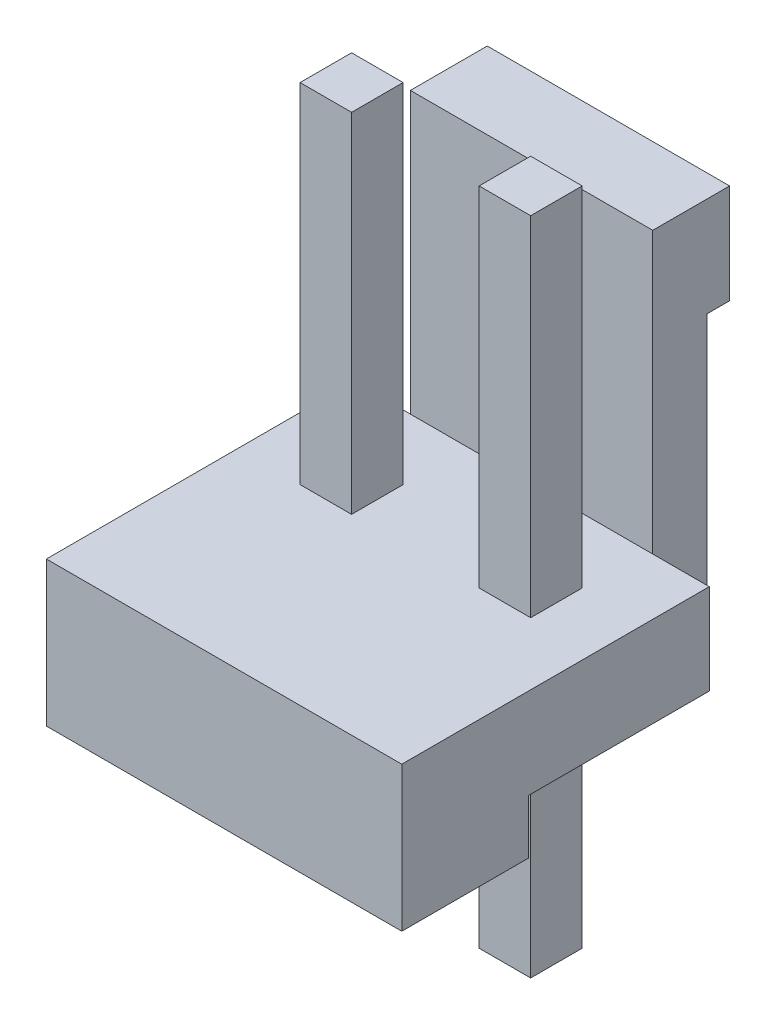
ISO-10303-21;
HEADER;
FILE_DESCRIPTION(('STEP AP214'),'2;1');
FILE_NAME('part.step','',(''),(''),'','','');
FILE_SCHEMA(('AUTOMOTIVE_DESIGN { 1 0 10303 214 1 1 1 1 }'));
ENDSEC;
DATA;
#1=APPLICATION_CONTEXT('core data for automotive mechanical design processes');
#2=APPLICATION_PROTOCOL_DEFINITION('international standard','automotive_design',2000,#1);
#3=PRODUCT_CONTEXT('',#1,'mechanical');
#4=PRODUCT('Part','Part','',(#3));
#5=PRODUCT_RELATED_PRODUCT_CATEGORY('part','',(#4));
#6=PRODUCT_DEFINITION_FORMATION('','',#4);
#7=PRODUCT_DEFINITION_CONTEXT('part definition',#1,'design');
#8=PRODUCT_DEFINITION('design','',#6,#7);
#9=PRODUCT_DEFINITION_SHAPE('','',#8);
#10=(LENGTH_UNIT() NAMED_UNIT(*) SI_UNIT(.MILLI.,.METRE.));
#11=(NAMED_UNIT(*) PLANE_ANGLE_UNIT() SI_UNIT($,.RADIAN.));
#12=(NAMED_UNIT(*) SI_UNIT($,.STERADIAN.) SOLID_ANGLE_UNIT());
#13=UNCERTAINTY_MEASURE_WITH_UNIT(LENGTH_MEASURE(1.E-05),#10,'distance_accuracy_value','');
#14=(GEOMETRIC_REPRESENTATION_CONTEXT(3) GLOBAL_UNCERTAINTY_ASSIGNED_CONTEXT((#13)) GLOBAL_UNIT_ASSIGNED_CONTEXT((#10,
#11,#12)) REPRESENTATION_CONTEXT('',''));
#15=CARTESIAN_POINT('',(0.,0.,0.));
#16=DIRECTION('',(0.,0.,1.));
#17=DIRECTION('',(1.,0.,0.));
#18=AXIS2_PLACEMENT_3D('',#15,#16,#17);
#19=CARTESIAN_POINT('',(1.41,10.9,-1.12));
#20=DIRECTION('',(1.,0.,0.));
#21=DIRECTION('',(0.,1.,0.));
#22=AXIS2_PLACEMENT_3D('',#19,#20,#21);
#23=PLANE('',#22);
#24=DIRECTION('',(0.,-1.,0.));
#25=VECTOR('',#24,1.);
#26=CARTESIAN_POINT('',(1.41,10.9,-1.12));
#27=LINE('',#26,#25);
#28=CARTESIAN_POINT('',(1.40999999999998,1.2,-1.11999999999999));
#29=VERTEX_POINT('',#28);
#30=CARTESIAN_POINT('',(1.40999999999999,-3.7,-1.11999999999997));
#31=VERTEX_POINT('',#30);
#32=EDGE_CURVE('E210',#29,#31,#27,.T.);
#33=ORIENTED_EDGE('',*,*,#32,.T.);
#34=DIRECTION('',(0.,0.,1.));
#35=VECTOR('',#34,1.);
#36=CARTESIAN_POINT('',(1.41,-3.7,0.02000000000004));
#37=LINE('',#36,#35);
#38=CARTESIAN_POINT('',(1.40999999999999,-3.7,0.0200000000000362));
#39=VERTEX_POINT('',#38);
#40=EDGE_CURVE('E286',#31,#39,#37,.T.);
#41=ORIENTED_EDGE('',*,*,#40,.T.);
#42=DIRECTION('',(0.,1.,0.));
#43=VECTOR('',#42,1.);
#44=CARTESIAN_POINT('',(1.41,10.9,0.01999999999999));
#45=LINE('',#44,#43);
#46=CARTESIAN_POINT('',(1.40999999999998,1.2,0.0200000000000216));
#47=VERTEX_POINT('',#46);
#48=EDGE_CURVE('E215',#39,#47,#45,.T.);
#49=ORIENTED_EDGE('',*,*,#48,.T.);
#50=DIRECTION('',(0.,0.,1.));
#51=VECTOR('',#50,1.);
#52=CARTESIAN_POINT('',(1.40999999999997,1.2,-1.12));
#53=LINE('',#52,#51);
#54=EDGE_CURVE('E20',#29,#47,#53,.T.);
#55=ORIENTED_EDGE('',*,*,#54,.F.);
#56=EDGE_LOOP('',(#33,#41,#49,#55));
#57=FACE_BOUND('',#56,.T.);
#58=ADVANCED_FACE('F17',(#57),#23,.F.);
#59=CARTESIAN_POINT('',(-2.55,10.9,-1.12));
#60=DIRECTION('',(1.,0.,0.));
#61=DIRECTION('',(0.,1.,0.));
#62=AXIS2_PLACEMENT_3D('',#59,#60,#61);
#63=PLANE('',#62);
#64=DIRECTION('',(0.,-1.,0.));
#65=VECTOR('',#64,1.);
#66=CARTESIAN_POINT('',(-2.55,10.9,-1.12));
#67=LINE('',#66,#65);
#68=CARTESIAN_POINT('',(-2.55000000000002,1.2,-1.11999999999999));
#69=VERTEX_POINT('',#68);
#70=CARTESIAN_POINT('',(-2.55000000000001,-3.7,-1.11999999999997));
#71=VERTEX_POINT('',#70);
#72=EDGE_CURVE('E274',#69,#71,#67,.T.);
#73=ORIENTED_EDGE('',*,*,#72,.T.);
#74=DIRECTION('',(0.,0.,1.));
#75=VECTOR('',#74,1.);
#76=CARTESIAN_POINT('',(-2.55,-3.7,0.02000000000004));
#77=LINE('',#76,#75);
#78=CARTESIAN_POINT('',(-2.55000000000001,-3.7,0.0200000000000362));
#79=VERTEX_POINT('',#78);
#80=EDGE_CURVE('E252',#71,#79,#77,.T.);
#81=ORIENTED_EDGE('',*,*,#80,.T.);
#82=DIRECTION('',(0.,1.,0.));
#83=VECTOR('',#82,1.);
#84=CARTESIAN_POINT('',(-2.55,10.9,0.01999999999999));
#85=LINE('',#84,#83);
#86=CARTESIAN_POINT('',(-2.55000000000002,1.2,0.0200000000000216));
#87=VERTEX_POINT('',#86);
#88=EDGE_CURVE('E249',#79,#87,#85,.T.);
#89=ORIENTED_EDGE('',*,*,#88,.T.);
#90=DIRECTION('',(0.,0.,1.));
#91=VECTOR('',#90,1.);
#92=CARTESIAN_POINT('',(-2.55000000000003,1.2,-1.12));
#93=LINE('',#92,#91);
#94=EDGE_CURVE('E218',#69,#87,#93,.T.);
#95=ORIENTED_EDGE('',*,*,#94,.F.);
#96=EDGE_LOOP('',(#73,#81,#89,#95));
#97=FACE_BOUND('',#96,.T.);
#98=ADVANCED_FACE('F250',(#97),#63,.F.);
#99=CARTESIAN_POINT('',(-3.93,7.2,-4.25));
#100=DIRECTION('',(0.,-1.,0.));
#101=DIRECTION('',(0.,0.,-1.));
#102=AXIS2_PLACEMENT_3D('',#99,#100,#101);
#103=PLANE('',#102);
#104=DIRECTION('',(0.,0.,-1.));
#105=VECTOR('',#104,1.);
#106=CARTESIAN_POINT('',(2.68,7.19999999999998,-4.25));
#107=LINE('',#106,#105);
#108=CARTESIAN_POINT('',(2.68,7.19999999999999,-4.25));
#109=VERTEX_POINT('',#108);
#110=CARTESIAN_POINT('',(2.68,7.19999999999999,-3.75000000000001));
#111=VERTEX_POINT('',#110);
#112=EDGE_CURVE('E231',#109,#111,#107,.F.);
#113=ORIENTED_EDGE('',*,*,#112,.T.);
#114=DIRECTION('',(1.,0.,0.));
#115=VECTOR('',#114,1.);
#116=CARTESIAN_POINT('',(-3.93,7.2,-3.75000000000002));
#117=LINE('',#116,#115);
#118=CARTESIAN_POINT('',(-2.68,7.2,-3.75000000000001));
#119=VERTEX_POINT('',#118);
#120=EDGE_CURVE('E264',#119,#111,#117,.T.);
#121=ORIENTED_EDGE('',*,*,#120,.F.);
#122=DIRECTION('',(0.,0.,-1.));
#123=VECTOR('',#122,1.);
#124=CARTESIAN_POINT('',(-2.68,7.2,-4.25));
#125=LINE('',#124,#123);
#126=CARTESIAN_POINT('',(-2.68,7.2,-4.25));
#127=VERTEX_POINT('',#126);
#128=EDGE_CURVE('E233',#119,#127,#125,.T.);
#129=ORIENTED_EDGE('',*,*,#128,.T.);
#130=DIRECTION('',(1.,0.,0.));
#131=VECTOR('',#130,1.);
#132=CARTESIAN_POINT('',(-3.93,7.2,-4.25));
#133=LINE('',#132,#131);
#134=EDGE_CURVE('E373',#109,#127,#133,.F.);
#135=ORIENTED_EDGE('',*,*,#134,.F.);
#136=EDGE_LOOP('',(#113,#121,#129,#135));
#137=FACE_BOUND('',#136,.T.);
#138=ADVANCED_FACE('F399',(#137),#103,.T.);
#139=CARTESIAN_POINT('',(1.41,10.9,-1.12));
#140=DIRECTION('',(0.,0.,1.));
#141=DIRECTION('',(0.,-1.,0.));
#142=AXIS2_PLACEMENT_3D('',#139,#140,#141);
#143=PLANE('',#142);
#144=DIRECTION('',(0.,-1.,0.));
#145=VECTOR('',#144,1.);
#146=CARTESIAN_POINT('',(2.55,10.9,-1.12));
#147=LINE('',#146,#145);
#148=CARTESIAN_POINT('',(2.54999999999999,1.2,-1.11999999999998));
#149=VERTEX_POINT('',#148);
#150=CARTESIAN_POINT('',(2.54999999999999,-3.7,-1.11999999999997));
#151=VERTEX_POINT('',#150);
#152=EDGE_CURVE('E301',#149,#151,#147,.T.);
#153=ORIENTED_EDGE('',*,*,#152,.T.);
#154=DIRECTION('',(1.,0.,0.));
#155=VECTOR('',#154,1.);
#156=CARTESIAN_POINT('',(1.41,-3.7,-1.12));
#157=LINE('',#156,#155);
#158=EDGE_CURVE('E226',#151,#31,#157,.F.);
#159=ORIENTED_EDGE('',*,*,#158,.T.);
#160=ORIENTED_EDGE('',*,*,#32,.F.);
#161=DIRECTION('',(1.,0.,0.));
#162=VECTOR('',#161,1.);
#163=CARTESIAN_POINT('',(1.41,1.2,-1.11999999999996));
#164=LINE('',#163,#162);
#165=EDGE_CURVE('E220',#149,#29,#164,.F.);
#166=ORIENTED_EDGE('',*,*,#165,.F.);
#167=EDGE_LOOP('',(#153,#159,#160,#166));
#168=FACE_BOUND('',#167,.T.);
#169=ADVANCED_FACE('F228',(#168),#143,.F.);
#170=CARTESIAN_POINT('',(1.41,-3.7,0.02000000000004));
#171=DIRECTION('',(0.,1.,0.));
#172=DIRECTION('',(0.,0.,1.));
#173=AXIS2_PLACEMENT_3D('',#170,#171,#172);
#174=PLANE('',#173);
#175=ORIENTED_EDGE('',*,*,#158,.F.);
#176=DIRECTION('',(0.,0.,1.));
#177=VECTOR('',#176,1.);
#178=CARTESIAN_POINT('',(2.54999999999995,-3.7,-1.12));
#179=LINE('',#178,#177);
#180=CARTESIAN_POINT('',(2.54999999999999,-3.7,0.0200000000000412));
#181=VERTEX_POINT('',#180);
#182=EDGE_CURVE('E291',#151,#181,#179,.T.);
#183=ORIENTED_EDGE('',*,*,#182,.T.);
#184=DIRECTION('',(1.,0.,0.));
#185=VECTOR('',#184,1.);
#186=CARTESIAN_POINT('',(1.41,-3.7,0.0200000000000447));
#187=LINE('',#186,#185);
#188=EDGE_CURVE('E283',#181,#39,#187,.F.);
#189=ORIENTED_EDGE('',*,*,#188,.T.);
#190=ORIENTED_EDGE('',*,*,#40,.F.);
#191=EDGE_LOOP('',(#175,#183,#189,#190));
#192=FACE_BOUND('',#191,.T.);
#193=ADVANCED_FACE('F289',(#192),#174,.F.);
#194=CARTESIAN_POINT('',(1.41,10.9,0.01999999999999));
#195=DIRECTION('',(0.,0.,-1.));
#196=DIRECTION('',(0.,1.,0.));
#197=AXIS2_PLACEMENT_3D('',#194,#195,#196);
#198=PLANE('',#197);
#199=ORIENTED_EDGE('',*,*,#48,.F.);
#200=ORIENTED_EDGE('',*,*,#188,.F.);
#201=DIRECTION('',(0.,-1.,0.));
#202=VECTOR('',#201,1.);
#203=CARTESIAN_POINT('',(2.55,10.9,0.02000000000004));
#204=LINE('',#203,#202);
#205=CARTESIAN_POINT('',(2.54999999999999,1.2,0.0200000000000282));
#206=VERTEX_POINT('',#205);
#207=EDGE_CURVE('E296',#181,#206,#204,.F.);
#208=ORIENTED_EDGE('',*,*,#207,.T.);
#209=DIRECTION('',(1.,0.,0.));
#210=VECTOR('',#209,1.);
#211=CARTESIAN_POINT('',(1.41,1.2,0.0200000000000263));
#212=LINE('',#211,#210);
#213=EDGE_CURVE('E280',#47,#206,#212,.T.);
#214=ORIENTED_EDGE('',*,*,#213,.F.);
#215=EDGE_LOOP('',(#199,#200,#208,#214));
#216=FACE_BOUND('',#215,.T.);
#217=ADVANCED_FACE('F295',(#216),#198,.F.);
#218=CARTESIAN_POINT('',(-3.93,0.,-3.75));
#219=DIRECTION('',(0.,-1.,0.));
#220=DIRECTION('',(1.,0.,0.));
#221=AXIS2_PLACEMENT_3D('',#218,#219,#220);
#222=PLANE('',#221);
#223=DIRECTION('',(0.,0.,1.));
#224=VECTOR('',#223,1.);
#225=CARTESIAN_POINT('',(2.68,0.,-3.75));
#226=LINE('',#225,#224);
#227=CARTESIAN_POINT('',(2.67999999999999,0.,-3.75));
#228=VERTEX_POINT('',#227);
#229=CARTESIAN_POINT('',(2.67999999999999,0.,-2.55));
#230=VERTEX_POINT('',#229);
#231=EDGE_CURVE('E276',#228,#230,#226,.T.);
#232=ORIENTED_EDGE('',*,*,#231,.T.);
#233=DIRECTION('',(1.,0.,0.));
#234=VECTOR('',#233,1.);
#235=CARTESIAN_POINT('',(-3.93,0.,-2.55));
#236=LINE('',#235,#234);
#237=CARTESIAN_POINT('',(-2.68000000000001,0.,-2.55));
#238=VERTEX_POINT('',#237);
#239=EDGE_CURVE('E298',#238,#230,#236,.T.);
#240=ORIENTED_EDGE('',*,*,#239,.F.);
#241=DIRECTION('',(0.,0.,1.));
#242=VECTOR('',#241,1.);
#243=CARTESIAN_POINT('',(-2.68,0.,-3.75));
#244=LINE('',#243,#242);
#245=CARTESIAN_POINT('',(-2.68000000000001,0.,-3.75));
#246=VERTEX_POINT('',#245);
#247=EDGE_CURVE('E278',#238,#246,#244,.F.);
#248=ORIENTED_EDGE('',*,*,#247,.T.);
#249=DIRECTION('',(1.,0.,0.));
#250=VECTOR('',#249,1.);
#251=CARTESIAN_POINT('',(-3.93,0.,-3.75));
#252=LINE('',#251,#250);
#253=EDGE_CURVE('E376',#228,#246,#252,.F.);
#254=ORIENTED_EDGE('',*,*,#253,.F.);
#255=EDGE_LOOP('',(#232,#240,#248,#254));
#256=FACE_BOUND('',#255,.T.);
#257=ADVANCED_FACE('F393',(#256),#222,.T.);
#258=CARTESIAN_POINT('',(-2.55,10.9,-1.12));
#259=DIRECTION('',(0.,0.,1.));
#260=DIRECTION('',(0.,-1.,0.));
#261=AXIS2_PLACEMENT_3D('',#258,#259,#260);
#262=PLANE('',#261);
#263=DIRECTION('',(0.,-1.,0.));
#264=VECTOR('',#263,1.);
#265=CARTESIAN_POINT('',(-1.41,10.9,-1.12));
#266=LINE('',#265,#264);
#267=CARTESIAN_POINT('',(-1.41000000000001,1.2,-1.11999999999998));
#268=VERTEX_POINT('',#267);
#269=CARTESIAN_POINT('',(-1.41000000000001,-3.7,-1.11999999999997));
#270=VERTEX_POINT('',#269);
#271=EDGE_CURVE('E367',#268,#270,#266,.T.);
#272=ORIENTED_EDGE('',*,*,#271,.T.);
#273=DIRECTION('',(1.,0.,0.));
#274=VECTOR('',#273,1.);
#275=CARTESIAN_POINT('',(-2.55,-3.7,-1.12));
#276=LINE('',#275,#274);
#277=EDGE_CURVE('E270',#270,#71,#276,.F.);
#278=ORIENTED_EDGE('',*,*,#277,.T.);
#279=ORIENTED_EDGE('',*,*,#72,.F.);
#280=DIRECTION('',(1.,0.,0.));
#281=VECTOR('',#280,1.);
#282=CARTESIAN_POINT('',(-2.55,1.2,-1.11999999999996));
#283=LINE('',#282,#281);
#284=EDGE_CURVE('E245',#268,#69,#283,.F.);
#285=ORIENTED_EDGE('',*,*,#284,.F.);
#286=EDGE_LOOP('',(#272,#278,#279,#285));
#287=FACE_BOUND('',#286,.T.);
#288=ADVANCED_FACE('F825',(#287),#262,.F.);
#289=CARTESIAN_POINT('',(-2.55,-3.7,0.02000000000004));
#290=DIRECTION('',(0.,1.,0.));
#291=DIRECTION('',(0.,0.,1.));
#292=AXIS2_PLACEMENT_3D('',#289,#290,#291);
#293=PLANE('',#292);
#294=ORIENTED_EDGE('',*,*,#277,.F.);
#295=DIRECTION('',(0.,0.,1.));
#296=VECTOR('',#295,1.);
#297=CARTESIAN_POINT('',(-1.41000000000005,-3.7,-1.12));
#298=LINE('',#297,#296);
#299=CARTESIAN_POINT('',(-1.41000000000001,-3.7,0.0200000000000412));
#300=VERTEX_POINT('',#299);
#301=EDGE_CURVE('E365',#270,#300,#298,.T.);
#302=ORIENTED_EDGE('',*,*,#301,.T.);
#303=DIRECTION('',(1.,0.,0.));
#304=VECTOR('',#303,1.);
#305=CARTESIAN_POINT('',(-2.55,-3.7,0.0200000000000447));
#306=LINE('',#305,#304);
#307=EDGE_CURVE('E256',#300,#79,#306,.F.);
#308=ORIENTED_EDGE('',*,*,#307,.T.);
#309=ORIENTED_EDGE('',*,*,#80,.F.);
#310=EDGE_LOOP('',(#294,#302,#308,#309));
#311=FACE_BOUND('',#310,.T.);
#312=ADVANCED_FACE('F816',(#311),#293,.F.);
#313=CARTESIAN_POINT('',(-2.55,10.9,0.01999999999999));
#314=DIRECTION('',(0.,0.,-1.));
#315=DIRECTION('',(0.,1.,0.));
#316=AXIS2_PLACEMENT_3D('',#313,#314,#315);
#317=PLANE('',#316);
#318=ORIENTED_EDGE('',*,*,#88,.F.);
#319=ORIENTED_EDGE('',*,*,#307,.F.);
#320=DIRECTION('',(0.,-1.,0.));
#321=VECTOR('',#320,1.);
#322=CARTESIAN_POINT('',(-1.41,10.9,0.02000000000004));
#323=LINE('',#322,#321);
#324=CARTESIAN_POINT('',(-1.41000000000001,1.2,0.0200000000000282));
#325=VERTEX_POINT('',#324);
#326=EDGE_CURVE('E260',#300,#325,#323,.F.);
#327=ORIENTED_EDGE('',*,*,#326,.T.);
#328=DIRECTION('',(1.,0.,0.));
#329=VECTOR('',#328,1.);
#330=CARTESIAN_POINT('',(-2.55,1.2,0.0200000000000263));
#331=LINE('',#330,#329);
#332=EDGE_CURVE('E243',#87,#325,#331,.T.);
#333=ORIENTED_EDGE('',*,*,#332,.F.);
#334=EDGE_LOOP('',(#318,#319,#327,#333));
#335=FACE_BOUND('',#334,.T.);
#336=ADVANCED_FACE('F258',(#335),#317,.F.);
#337=CARTESIAN_POINT('',(1.41,10.9,-1.12));
#338=DIRECTION('',(1.,0.,0.));
#339=DIRECTION('',(0.,1.,0.));
#340=AXIS2_PLACEMENT_3D('',#337,#338,#339);
#341=PLANE('',#340);
#342=DIRECTION('',(0.,1.,0.));
#343=VECTOR('',#342,1.);
#344=CARTESIAN_POINT('',(1.41,10.9,0.01999999999999));
#345=LINE('',#344,#343);
#346=CARTESIAN_POINT('',(1.40999999999999,3.2,0.0200000000000023));
#347=VERTEX_POINT('',#346);
#348=CARTESIAN_POINT('',(1.41,10.9,0.01999999999999));
#349=VERTEX_POINT('',#348);
#350=EDGE_CURVE('E356',#347,#349,#345,.T.);
#351=ORIENTED_EDGE('',*,*,#350,.T.);
#352=DIRECTION('',(0.,0.,1.));
#353=VECTOR('',#352,1.);
#354=CARTESIAN_POINT('',(1.41,10.9,0.01999999999999));
#355=LINE('',#354,#353);
#356=CARTESIAN_POINT('',(1.41,10.9,-1.12));
#357=VERTEX_POINT('',#356);
#358=EDGE_CURVE('E350',#357,#349,#355,.T.);
#359=ORIENTED_EDGE('',*,*,#358,.F.);
#360=DIRECTION('',(0.,-1.,0.));
#361=VECTOR('',#360,1.);
#362=CARTESIAN_POINT('',(1.41,10.9,-1.12));
#363=LINE('',#362,#361);
#364=CARTESIAN_POINT('',(1.40999999999999,3.2,-1.11999999999999));
#365=VERTEX_POINT('',#364);
#366=EDGE_CURVE('E341',#357,#365,#363,.T.);
#367=ORIENTED_EDGE('',*,*,#366,.T.);
#368=DIRECTION('',(0.,0.,1.));
#369=VECTOR('',#368,1.);
#370=CARTESIAN_POINT('',(1.40999999999997,3.2,-1.12));
#371=LINE('',#370,#369);
#372=EDGE_CURVE('E262',#347,#365,#371,.F.);
#373=ORIENTED_EDGE('',*,*,#372,.F.);
#374=EDGE_LOOP('',(#351,#359,#367,#373));
#375=FACE_BOUND('',#374,.T.);
#376=ADVANCED_FACE('F800',(#375),#341,.F.);
#377=CARTESIAN_POINT('',(-3.93,0.,-3.75));
#378=DIRECTION('',(0.,0.,-1.));
#379=DIRECTION('',(0.,1.,0.));
#380=AXIS2_PLACEMENT_3D('',#377,#378,#379);
#381=PLANE('',#380);
#382=DIRECTION('',(0.,-1.,0.));
#383=VECTOR('',#382,1.);
#384=CARTESIAN_POINT('',(2.68,9.4,-3.75));
#385=LINE('',#384,#383);
#386=EDGE_CURVE('E326',#111,#228,#385,.T.);
#387=ORIENTED_EDGE('',*,*,#386,.T.);
#388=ORIENTED_EDGE('',*,*,#253,.T.);
#389=DIRECTION('',(0.,1.,0.));
#390=VECTOR('',#389,1.);
#391=CARTESIAN_POINT('',(-2.68,9.4,-3.75));
#392=LINE('',#391,#390);
#393=EDGE_CURVE('E329',#246,#119,#392,.T.);
#394=ORIENTED_EDGE('',*,*,#393,.T.);
#395=ORIENTED_EDGE('',*,*,#120,.T.);
#396=EDGE_LOOP('',(#387,#388,#394,#395));
#397=FACE_BOUND('',#396,.T.);
#398=ADVANCED_FACE('F382',(#397),#381,.T.);
#399=CARTESIAN_POINT('',(-3.93,7.2,-4.25));
#400=DIRECTION('',(0.,0.,-1.));
#401=DIRECTION('',(0.,1.,0.));
#402=AXIS2_PLACEMENT_3D('',#399,#400,#401);
#403=PLANE('',#402);
#404=DIRECTION('',(0.,-1.,0.));
#405=VECTOR('',#404,1.);
#406=CARTESIAN_POINT('',(2.68,9.4,-4.25));
#407=LINE('',#406,#405);
#408=CARTESIAN_POINT('',(2.68,9.4,-4.25));
#409=VERTEX_POINT('',#408);
#410=EDGE_CURVE('E318',#409,#109,#407,.T.);
#411=ORIENTED_EDGE('',*,*,#410,.T.);
#412=ORIENTED_EDGE('',*,*,#134,.T.);
#413=DIRECTION('',(0.,1.,0.));
#414=VECTOR('',#413,1.);
#415=CARTESIAN_POINT('',(-2.68,9.4,-4.25));
#416=LINE('',#415,#414);
#417=CARTESIAN_POINT('',(-2.68,9.4,-4.25));
#418=VERTEX_POINT('',#417);
#419=EDGE_CURVE('E335',#127,#418,#416,.T.);
#420=ORIENTED_EDGE('',*,*,#419,.T.);
#421=DIRECTION('',(1.,0.,0.));
#422=VECTOR('',#421,1.);
#423=CARTESIAN_POINT('',(-3.93,9.4,-4.25));
#424=LINE('',#423,#422);
#425=EDGE_CURVE('E303',#409,#418,#424,.F.);
#426=ORIENTED_EDGE('',*,*,#425,.F.);
#427=EDGE_LOOP('',(#411,#412,#420,#426));
#428=FACE_BOUND('',#427,.T.);
#429=ADVANCED_FACE('F401',(#428),#403,.T.);
#430=CARTESIAN_POINT('',(2.55,10.9,-1.12));
#431=DIRECTION('',(-1.,0.,0.));
#432=DIRECTION('',(0.,-1.,0.));
#433=AXIS2_PLACEMENT_3D('',#430,#431,#432);
#434=PLANE('',#433);
#435=ORIENTED_EDGE('',*,*,#207,.F.);
#436=ORIENTED_EDGE('',*,*,#182,.F.);
#437=ORIENTED_EDGE('',*,*,#152,.F.);
#438=DIRECTION('',(0.,0.,1.));
#439=VECTOR('',#438,1.);
#440=CARTESIAN_POINT('',(2.55,1.19999999999998,-2.55));
#441=LINE('',#440,#439);
#442=EDGE_CURVE('E223',#206,#149,#441,.F.);
#443=ORIENTED_EDGE('',*,*,#442,.F.);
#444=EDGE_LOOP('',(#435,#436,#437,#443));
#445=FACE_BOUND('',#444,.T.);
#446=ADVANCED_FACE('F300',(#445),#434,.F.);
#447=CARTESIAN_POINT('',(-3.93,0.,-2.55));
#448=DIRECTION('',(0.,0.,1.));
#449=DIRECTION('',(0.,-1.,0.));
#450=AXIS2_PLACEMENT_3D('',#447,#448,#449);
#451=PLANE('',#450);
#452=DIRECTION('',(0.,-1.,0.));
#453=VECTOR('',#452,1.);
#454=CARTESIAN_POINT('',(2.68,9.4,-2.55));
#455=LINE('',#454,#453);
#456=CARTESIAN_POINT('',(2.67999999999999,1.2,-2.55));
#457=VERTEX_POINT('',#456);
#458=EDGE_CURVE('E324',#230,#457,#455,.F.);
#459=ORIENTED_EDGE('',*,*,#458,.T.);
#460=DIRECTION('',(1.,0.,0.));
#461=VECTOR('',#460,1.);
#462=CARTESIAN_POINT('',(-3.93,1.2,-2.55));
#463=LINE('',#462,#461);
#464=CARTESIAN_POINT('',(-2.68,1.2,-2.55));
#465=VERTEX_POINT('',#464);
#466=EDGE_CURVE('E306',#465,#457,#463,.T.);
#467=ORIENTED_EDGE('',*,*,#466,.F.);
#468=DIRECTION('',(0.,1.,0.));
#469=VECTOR('',#468,1.);
#470=CARTESIAN_POINT('',(-2.68,9.4,-2.55));
#471=LINE('',#470,#469);
#472=EDGE_CURVE('E332',#465,#238,#471,.F.);
#473=ORIENTED_EDGE('',*,*,#472,.T.);
#474=ORIENTED_EDGE('',*,*,#239,.T.);
#475=EDGE_LOOP('',(#459,#467,#473,#474));
#476=FACE_BOUND('',#475,.T.);
#477=ADVANCED_FACE('F537',(#476),#451,.T.);
#478=CARTESIAN_POINT('',(-1.41,10.9,-1.12));
#479=DIRECTION('',(-1.,0.,0.));
#480=DIRECTION('',(0.,-1.,0.));
#481=AXIS2_PLACEMENT_3D('',#478,#479,#480);
#482=PLANE('',#481);
#483=ORIENTED_EDGE('',*,*,#326,.F.);
#484=ORIENTED_EDGE('',*,*,#301,.F.);
#485=ORIENTED_EDGE('',*,*,#271,.F.);
#486=DIRECTION('',(0.,0.,1.));
#487=VECTOR('',#486,1.);
#488=CARTESIAN_POINT('',(-1.41,1.19999999999999,-2.55));
#489=LINE('',#488,#487);
#490=EDGE_CURVE('E468',#325,#268,#489,.F.);
#491=ORIENTED_EDGE('',*,*,#490,.F.);
#492=EDGE_LOOP('',(#483,#484,#485,#491));
#493=FACE_BOUND('',#492,.T.);
#494=ADVANCED_FACE('F539',(#493),#482,.F.);
#495=CARTESIAN_POINT('',(-3.93,1.2,1.45));
#496=DIRECTION('',(0.,0.,-1.));
#497=DIRECTION('',(0.,1.,0.));
#498=AXIS2_PLACEMENT_3D('',#495,#496,#497);
#499=PLANE('',#498);
#500=DIRECTION('',(0.,1.,0.));
#501=VECTOR('',#500,1.);
#502=CARTESIAN_POINT('',(-3.93,1.2,1.45));
#503=LINE('',#502,#501);
#504=CARTESIAN_POINT('',(-3.93,0.,1.45));
#505=VERTEX_POINT('',#504);
#506=CARTESIAN_POINT('',(-3.93,1.2,1.45));
#507=VERTEX_POINT('',#506);
#508=EDGE_CURVE('E360',#505,#507,#503,.T.);
#509=ORIENTED_EDGE('',*,*,#508,.T.);
#510=DIRECTION('',(1.,0.,0.));
#511=VECTOR('',#510,1.);
#512=CARTESIAN_POINT('',(-3.93,1.20000000000001,1.45));
#513=LINE('',#512,#511);
#514=CARTESIAN_POINT('',(3.93,1.2,1.45));
#515=VERTEX_POINT('',#514);
#516=EDGE_CURVE('E302',#515,#507,#513,.F.);
#517=ORIENTED_EDGE('',*,*,#516,.F.);
#518=DIRECTION('',(0.,1.,0.));
#519=VECTOR('',#518,1.);
#520=CARTESIAN_POINT('',(3.93,1.2,1.45));
#521=LINE('',#520,#519);
#522=CARTESIAN_POINT('',(3.93,0.,1.45));
#523=VERTEX_POINT('',#522);
#524=EDGE_CURVE('E362',#515,#523,#521,.F.);
#525=ORIENTED_EDGE('',*,*,#524,.T.);
#526=DIRECTION('',(1.,0.,0.));
#527=VECTOR('',#526,1.);
#528=CARTESIAN_POINT('',(-3.93,0.,1.45));
#529=LINE('',#528,#527);
#530=EDGE_CURVE('E458',#505,#523,#529,.T.);
#531=ORIENTED_EDGE('',*,*,#530,.F.);
#532=EDGE_LOOP('',(#509,#517,#525,#531));
#533=FACE_BOUND('',#532,.T.);
#534=ADVANCED_FACE('F529',(#533),#499,.T.);
#535=CARTESIAN_POINT('',(-2.55,10.9,-1.12));
#536=DIRECTION('',(1.,0.,0.));
#537=DIRECTION('',(0.,1.,0.));
#538=AXIS2_PLACEMENT_3D('',#535,#536,#537);
#539=PLANE('',#538);
#540=DIRECTION('',(0.,1.,0.));
#541=VECTOR('',#540,1.);
#542=CARTESIAN_POINT('',(-2.55,10.9,0.01999999999999));
#543=LINE('',#542,#541);
#544=CARTESIAN_POINT('',(-2.55000000000001,3.2,0.0200000000000023));
#545=VERTEX_POINT('',#544);
#546=CARTESIAN_POINT('',(-2.55,10.9,0.01999999999999));
#547=VERTEX_POINT('',#546);
#548=EDGE_CURVE('E456',#545,#547,#543,.T.);
#549=ORIENTED_EDGE('',*,*,#548,.T.);
#550=DIRECTION('',(0.,0.,1.));
#551=VECTOR('',#550,1.);
#552=CARTESIAN_POINT('',(-2.55,10.9,0.01999999999999));
#553=LINE('',#552,#551);
#554=CARTESIAN_POINT('',(-2.55,10.9,-1.12));
#555=VERTEX_POINT('',#554);
#556=EDGE_CURVE('E450',#555,#547,#553,.T.);
#557=ORIENTED_EDGE('',*,*,#556,.F.);
#558=DIRECTION('',(0.,-1.,0.));
#559=VECTOR('',#558,1.);
#560=CARTESIAN_POINT('',(-2.55,10.9,-1.12));
#561=LINE('',#560,#559);
#562=CARTESIAN_POINT('',(-2.55000000000001,3.2,-1.11999999999999));
#563=VERTEX_POINT('',#562);
#564=EDGE_CURVE('E441',#555,#563,#561,.T.);
#565=ORIENTED_EDGE('',*,*,#564,.T.);
#566=DIRECTION('',(0.,0.,1.));
#567=VECTOR('',#566,1.);
#568=CARTESIAN_POINT('',(-2.55000000000003,3.2,-1.12));
#569=LINE('',#568,#567);
#570=EDGE_CURVE('E358',#545,#563,#569,.F.);
#571=ORIENTED_EDGE('',*,*,#570,.F.);
#572=EDGE_LOOP('',(#549,#557,#565,#571));
#573=FACE_BOUND('',#572,.T.);
#574=ADVANCED_FACE('F607',(#573),#539,.F.);
#575=CARTESIAN_POINT('',(1.41,10.9,0.01999999999999));
#576=DIRECTION('',(0.,0.,-1.));
#577=DIRECTION('',(0.,1.,0.));
#578=AXIS2_PLACEMENT_3D('',#575,#576,#577);
#579=PLANE('',#578);
#580=DIRECTION('',(0.,-1.,0.));
#581=VECTOR('',#580,1.);
#582=CARTESIAN_POINT('',(2.55,10.9,0.02000000000001));
#583=LINE('',#582,#581);
#584=CARTESIAN_POINT('',(2.54999999999999,3.2,0.0200000000000144));
#585=VERTEX_POINT('',#584);
#586=CARTESIAN_POINT('',(2.55,10.9,0.019999999999995));
#587=VERTEX_POINT('',#586);
#588=EDGE_CURVE('E438',#585,#587,#583,.F.);
#589=ORIENTED_EDGE('',*,*,#588,.T.);
#590=DIRECTION('',(1.,0.,0.));
#591=VECTOR('',#590,1.);
#592=CARTESIAN_POINT('',(1.41,10.9,0.01999999999999));
#593=LINE('',#592,#591);
#594=EDGE_CURVE('E347',#349,#587,#593,.T.);
#595=ORIENTED_EDGE('',*,*,#594,.F.);
#596=ORIENTED_EDGE('',*,*,#350,.F.);
#597=DIRECTION('',(1.,0.,0.));
#598=VECTOR('',#597,1.);
#599=CARTESIAN_POINT('',(1.41,3.2,0.0200000000000189));
#600=LINE('',#599,#598);
#601=EDGE_CURVE('E353',#585,#347,#600,.F.);
#602=ORIENTED_EDGE('',*,*,#601,.F.);
#603=EDGE_LOOP('',(#589,#595,#596,#602));
#604=FACE_BOUND('',#603,.T.);
#605=ADVANCED_FACE('F603',(#604),#579,.F.);
#606=CARTESIAN_POINT('',(1.41,10.9,0.01999999999999));
#607=DIRECTION('',(0.,1.,0.));
#608=DIRECTION('',(0.,0.,1.));
#609=AXIS2_PLACEMENT_3D('',#606,#607,#608);
#610=PLANE('',#609);
#611=DIRECTION('',(0.,0.,1.));
#612=VECTOR('',#611,1.);
#613=CARTESIAN_POINT('',(2.55,10.9,-1.12));
#614=LINE('',#613,#612);
#615=CARTESIAN_POINT('',(2.55,10.9,-1.12));
#616=VERTEX_POINT('',#615);
#617=EDGE_CURVE('E436',#587,#616,#614,.F.);
#618=ORIENTED_EDGE('',*,*,#617,.T.);
#619=DIRECTION('',(1.,0.,0.));
#620=VECTOR('',#619,1.);
#621=CARTESIAN_POINT('',(1.41,10.9,-1.12));
#622=LINE('',#621,#620);
#623=EDGE_CURVE('E344',#616,#357,#622,.F.);
#624=ORIENTED_EDGE('',*,*,#623,.T.);
#625=ORIENTED_EDGE('',*,*,#358,.T.);
#626=ORIENTED_EDGE('',*,*,#594,.T.);
#627=EDGE_LOOP('',(#618,#624,#625,#626));
#628=FACE_BOUND('',#627,.T.);
#629=ADVANCED_FACE('F599',(#628),#610,.T.);
#630=CARTESIAN_POINT('',(1.41,10.9,-1.12));
#631=DIRECTION('',(0.,0.,1.));
#632=DIRECTION('',(0.,-1.,0.));
#633=AXIS2_PLACEMENT_3D('',#630,#631,#632);
#634=PLANE('',#633);
#635=ORIENTED_EDGE('',*,*,#366,.F.);
#636=ORIENTED_EDGE('',*,*,#623,.F.);
#637=DIRECTION('',(0.,-1.,0.));
#638=VECTOR('',#637,1.);
#639=CARTESIAN_POINT('',(2.55,10.9,-1.12));
#640=LINE('',#639,#638);
#641=CARTESIAN_POINT('',(2.54999999999999,3.2,-1.11999999999999));
#642=VERTEX_POINT('',#641);
#643=EDGE_CURVE('E433',#616,#642,#640,.T.);
#644=ORIENTED_EDGE('',*,*,#643,.T.);
#645=DIRECTION('',(1.,0.,0.));
#646=VECTOR('',#645,1.);
#647=CARTESIAN_POINT('',(1.41,3.2,-1.11999999999997));
#648=LINE('',#647,#646);
#649=EDGE_CURVE('E339',#365,#642,#648,.T.);
#650=ORIENTED_EDGE('',*,*,#649,.F.);
#651=EDGE_LOOP('',(#635,#636,#644,#650));
#652=FACE_BOUND('',#651,.T.);
#653=ADVANCED_FACE('F596',(#652),#634,.F.);
#654=CARTESIAN_POINT('',(3.93,9.4,-2.55));
#655=DIRECTION('',(0.,0.,1.));
#656=DIRECTION('',(0.,-1.,0.));
#657=AXIS2_PLACEMENT_3D('',#654,#655,#656);
#658=PLANE('',#657);
#659=DIRECTION('',(0.,1.,0.));
#660=VECTOR('',#659,1.);
#661=CARTESIAN_POINT('',(3.93,0.,-2.55));
#662=LINE('',#661,#660);
#663=CARTESIAN_POINT('',(3.93,1.19999999999999,-2.54999999999999));
#664=VERTEX_POINT('',#663);
#665=CARTESIAN_POINT('',(3.93,3.19999999999999,-2.54999999999999));
#666=VERTEX_POINT('',#665);
#667=EDGE_CURVE('E430',#664,#666,#662,.T.);
#668=ORIENTED_EDGE('',*,*,#667,.F.);
#669=DIRECTION('',(1.,0.,0.));
#670=VECTOR('',#669,1.);
#671=CARTESIAN_POINT('',(-3.93,1.2,-2.55));
#672=LINE('',#671,#670);
#673=EDGE_CURVE('E470',#457,#664,#672,.T.);
#674=ORIENTED_EDGE('',*,*,#673,.F.);
#675=DIRECTION('',(0.,-1.,0.));
#676=VECTOR('',#675,1.);
#677=CARTESIAN_POINT('',(2.68,9.4,-2.55));
#678=LINE('',#677,#676);
#679=CARTESIAN_POINT('',(2.67999999999999,3.2,-2.54999999999999));
#680=VERTEX_POINT('',#679);
#681=EDGE_CURVE('E321',#457,#680,#678,.F.);
#682=ORIENTED_EDGE('',*,*,#681,.T.);
#683=DIRECTION('',(1.,0.,0.));
#684=VECTOR('',#683,1.);
#685=CARTESIAN_POINT('',(3.93,3.2,-2.54999999999998));
#686=LINE('',#685,#684);
#687=EDGE_CURVE('E337',#666,#680,#686,.F.);
#688=ORIENTED_EDGE('',*,*,#687,.F.);
#689=EDGE_LOOP('',(#668,#674,#682,#688));
#690=FACE_BOUND('',#689,.T.);
#691=ADVANCED_FACE('F478',(#690),#658,.F.);
#692=CARTESIAN_POINT('',(-2.68,9.4,-4.25));
#693=DIRECTION('',(1.,0.,0.));
#694=DIRECTION('',(0.,1.,0.));
#695=AXIS2_PLACEMENT_3D('',#692,#693,#694);
#696=PLANE('',#695);
#697=ORIENTED_EDGE('',*,*,#393,.F.);
#698=ORIENTED_EDGE('',*,*,#247,.F.);
#699=ORIENTED_EDGE('',*,*,#472,.F.);
#700=DIRECTION('',(0.,-1.,0.));
#701=VECTOR('',#700,1.);
#702=CARTESIAN_POINT('',(-2.68,9.4,-2.55));
#703=LINE('',#702,#701);
#704=CARTESIAN_POINT('',(-2.68000000000001,3.2,-2.54999999999999));
#705=VERTEX_POINT('',#704);
#706=EDGE_CURVE('E463',#465,#705,#703,.F.);
#707=ORIENTED_EDGE('',*,*,#706,.T.);
#708=DIRECTION('',(0.,-1.,0.));
#709=VECTOR('',#708,1.);
#710=CARTESIAN_POINT('',(-2.68,9.4,-2.55));
#711=LINE('',#710,#709);
#712=CARTESIAN_POINT('',(-2.68,9.4,-2.55));
#713=VERTEX_POINT('',#712);
#714=EDGE_CURVE('E419',#713,#705,#711,.T.);
#715=ORIENTED_EDGE('',*,*,#714,.F.);
#716=DIRECTION('',(0.,0.,1.));
#717=VECTOR('',#716,1.);
#718=CARTESIAN_POINT('',(-2.68,9.4,-4.25));
#719=LINE('',#718,#717);
#720=EDGE_CURVE('E315',#418,#713,#719,.T.);
#721=ORIENTED_EDGE('',*,*,#720,.F.);
#722=ORIENTED_EDGE('',*,*,#419,.F.);
#723=ORIENTED_EDGE('',*,*,#128,.F.);
#724=EDGE_LOOP('',(#697,#698,#699,#707,#715,#721,#722,#723));
#725=FACE_BOUND('',#724,.T.);
#726=ADVANCED_FACE('F395',(#725),#696,.F.);
#727=CARTESIAN_POINT('',(2.68,9.4,-4.25));
#728=DIRECTION('',(-1.,0.,0.));
#729=DIRECTION('',(0.,-1.,0.));
#730=AXIS2_PLACEMENT_3D('',#727,#728,#729);
#731=PLANE('',#730);
#732=ORIENTED_EDGE('',*,*,#410,.F.);
#733=DIRECTION('',(0.,0.,1.));
#734=VECTOR('',#733,1.);
#735=CARTESIAN_POINT('',(2.68,9.39999999999998,-4.25));
#736=LINE('',#735,#734);
#737=CARTESIAN_POINT('',(2.68,9.4,-2.55));
#738=VERTEX_POINT('',#737);
#739=EDGE_CURVE('E309',#738,#409,#736,.F.);
#740=ORIENTED_EDGE('',*,*,#739,.F.);
#741=DIRECTION('',(0.,-1.,0.));
#742=VECTOR('',#741,1.);
#743=CARTESIAN_POINT('',(2.68,9.4,-2.55));
#744=LINE('',#743,#742);
#745=EDGE_CURVE('E406',#680,#738,#744,.F.);
#746=ORIENTED_EDGE('',*,*,#745,.F.);
#747=ORIENTED_EDGE('',*,*,#681,.F.);
#748=ORIENTED_EDGE('',*,*,#458,.F.);
#749=ORIENTED_EDGE('',*,*,#231,.F.);
#750=ORIENTED_EDGE('',*,*,#386,.F.);
#751=ORIENTED_EDGE('',*,*,#112,.F.);
#752=EDGE_LOOP('',(#732,#740,#746,#747,#748,#749,#750,#751));
#753=FACE_BOUND('',#752,.T.);
#754=ADVANCED_FACE('F386',(#753),#731,.F.);
#755=CARTESIAN_POINT('',(-3.93,9.4,-4.25));
#756=DIRECTION('',(0.,1.,0.));
#757=DIRECTION('',(0.,0.,1.));
#758=AXIS2_PLACEMENT_3D('',#755,#756,#757);
#759=PLANE('',#758);
#760=ORIENTED_EDGE('',*,*,#739,.T.);
#761=ORIENTED_EDGE('',*,*,#425,.T.);
#762=ORIENTED_EDGE('',*,*,#720,.T.);
#763=DIRECTION('',(1.,0.,0.));
#764=VECTOR('',#763,1.);
#765=CARTESIAN_POINT('',(-3.93,9.4,-2.55));
#766=LINE('',#765,#764);
#767=EDGE_CURVE('E410',#738,#713,#766,.F.);
#768=ORIENTED_EDGE('',*,*,#767,.F.);
#769=EDGE_LOOP('',(#760,#761,#762,#768));
#770=FACE_BOUND('',#769,.T.);
#771=ADVANCED_FACE('F411',(#770),#759,.T.);
#772=CARTESIAN_POINT('',(-3.93,1.2,-2.55));
#773=DIRECTION('',(0.,-1.,0.));
#774=DIRECTION('',(1.,0.,0.));
#775=AXIS2_PLACEMENT_3D('',#772,#773,#774);
#776=PLANE('',#775);
#777=ORIENTED_EDGE('',*,*,#332,.T.);
#778=ORIENTED_EDGE('',*,*,#490,.T.);
#779=ORIENTED_EDGE('',*,*,#284,.T.);
#780=ORIENTED_EDGE('',*,*,#94,.T.);
#781=EDGE_LOOP('',(#777,#778,#779,#780));
#782=FACE_BOUND('',#781,.T.);
#783=ORIENTED_EDGE('',*,*,#466,.T.);
#784=ORIENTED_EDGE('',*,*,#673,.T.);
#785=DIRECTION('',(0.,0.,1.));
#786=VECTOR('',#785,1.);
#787=CARTESIAN_POINT('',(3.93,1.2,4.25));
#788=LINE('',#787,#786);
#789=EDGE_CURVE('E421',#515,#664,#788,.F.);
#790=ORIENTED_EDGE('',*,*,#789,.F.);
#791=ORIENTED_EDGE('',*,*,#516,.T.);
#792=DIRECTION('',(0.,0.,1.));
#793=VECTOR('',#792,1.);
#794=CARTESIAN_POINT('',(-3.93,1.2,4.25));
#795=LINE('',#794,#793);
#796=CARTESIAN_POINT('',(-3.93,1.2,-2.54999999999999));
#797=VERTEX_POINT('',#796);
#798=EDGE_CURVE('E516',#507,#797,#795,.F.);
#799=ORIENTED_EDGE('',*,*,#798,.T.);
#800=DIRECTION('',(1.,0.,0.));
#801=VECTOR('',#800,1.);
#802=CARTESIAN_POINT('',(-3.93,1.2,-2.54999999999997));
#803=LINE('',#802,#801);
#804=EDGE_CURVE('E465',#797,#465,#803,.T.);
#805=ORIENTED_EDGE('',*,*,#804,.T.);
#806=EDGE_LOOP('',(#783,#784,#790,#791,#799,#805));
#807=FACE_BOUND('',#806,.T.);
#808=ORIENTED_EDGE('',*,*,#213,.T.);
#809=ORIENTED_EDGE('',*,*,#442,.T.);
#810=ORIENTED_EDGE('',*,*,#165,.T.);
#811=ORIENTED_EDGE('',*,*,#54,.T.);
#812=EDGE_LOOP('',(#808,#809,#810,#811));
#813=FACE_BOUND('',#812,.T.);
#814=ADVANCED_FACE('F221',(#782,#807,#813),#776,.T.);
#815=CARTESIAN_POINT('',(-3.93,9.4,-2.55));
#816=DIRECTION('',(0.,0.,1.));
#817=DIRECTION('',(0.,-1.,0.));
#818=AXIS2_PLACEMENT_3D('',#815,#816,#817);
#819=PLANE('',#818);
#820=ORIENTED_EDGE('',*,*,#706,.F.);
#821=ORIENTED_EDGE('',*,*,#804,.F.);
#822=DIRECTION('',(0.,1.,0.));
#823=VECTOR('',#822,1.);
#824=CARTESIAN_POINT('',(-3.93,0.,-2.55));
#825=LINE('',#824,#823);
#826=CARTESIAN_POINT('',(-3.93,3.2,-2.54999999999999));
#827=VERTEX_POINT('',#826);
#828=EDGE_CURVE('E513',#797,#827,#825,.T.);
#829=ORIENTED_EDGE('',*,*,#828,.T.);
#830=DIRECTION('',(1.,0.,0.));
#831=VECTOR('',#830,1.);
#832=CARTESIAN_POINT('',(-3.93,3.2,-2.54999999999998));
#833=LINE('',#832,#831);
#834=EDGE_CURVE('E461',#705,#827,#833,.F.);
#835=ORIENTED_EDGE('',*,*,#834,.F.);
#836=EDGE_LOOP('',(#820,#821,#829,#835));
#837=FACE_BOUND('',#836,.T.);
#838=ADVANCED_FACE('F536',(#837),#819,.F.);
#839=CARTESIAN_POINT('',(-3.93,0.,1.45));
#840=DIRECTION('',(0.,-1.,0.));
#841=DIRECTION('',(0.,0.,-1.));
#842=AXIS2_PLACEMENT_3D('',#839,#840,#841);
#843=PLANE('',#842);
#844=DIRECTION('',(0.,0.,1.));
#845=VECTOR('',#844,1.);
#846=CARTESIAN_POINT('',(-3.93,0.,4.25));
#847=LINE('',#846,#845);
#848=CARTESIAN_POINT('',(-3.93,0.,4.25));
#849=VERTEX_POINT('',#848);
#850=EDGE_CURVE('E414',#849,#505,#847,.F.);
#851=ORIENTED_EDGE('',*,*,#850,.T.);
#852=ORIENTED_EDGE('',*,*,#530,.T.);
#853=DIRECTION('',(0.,0.,1.));
#854=VECTOR('',#853,1.);
#855=CARTESIAN_POINT('',(3.93,0.,4.25));
#856=LINE('',#855,#854);
#857=CARTESIAN_POINT('',(3.93,0.,4.25));
#858=VERTEX_POINT('',#857);
#859=EDGE_CURVE('E427',#858,#523,#856,.F.);
#860=ORIENTED_EDGE('',*,*,#859,.F.);
#861=DIRECTION('',(1.,0.,0.));
#862=VECTOR('',#861,1.);
#863=CARTESIAN_POINT('',(-3.93,0.,4.25000000000001));
#864=LINE('',#863,#862);
#865=EDGE_CURVE('E505',#849,#858,#864,.T.);
#866=ORIENTED_EDGE('',*,*,#865,.F.);
#867=EDGE_LOOP('',(#851,#852,#860,#866));
#868=FACE_BOUND('',#867,.T.);
#869=ADVANCED_FACE('F520',(#868),#843,.T.);
#870=CARTESIAN_POINT('',(-2.55,10.9,0.01999999999999));
#871=DIRECTION('',(0.,0.,-1.));
#872=DIRECTION('',(0.,1.,0.));
#873=AXIS2_PLACEMENT_3D('',#870,#871,#872);
#874=PLANE('',#873);
#875=DIRECTION('',(0.,-1.,0.));
#876=VECTOR('',#875,1.);
#877=CARTESIAN_POINT('',(-1.41,10.9,0.02000000000001));
#878=LINE('',#877,#876);
#879=CARTESIAN_POINT('',(-1.41000000000001,3.2,0.0200000000000144));
#880=VERTEX_POINT('',#879);
#881=CARTESIAN_POINT('',(-1.41,10.9,0.019999999999995));
#882=VERTEX_POINT('',#881);
#883=EDGE_CURVE('E503',#880,#882,#878,.F.);
#884=ORIENTED_EDGE('',*,*,#883,.T.);
#885=DIRECTION('',(1.,0.,0.));
#886=VECTOR('',#885,1.);
#887=CARTESIAN_POINT('',(-2.55,10.9,0.01999999999999));
#888=LINE('',#887,#886);
#889=EDGE_CURVE('E447',#547,#882,#888,.T.);
#890=ORIENTED_EDGE('',*,*,#889,.F.);
#891=ORIENTED_EDGE('',*,*,#548,.F.);
#892=DIRECTION('',(1.,0.,0.));
#893=VECTOR('',#892,1.);
#894=CARTESIAN_POINT('',(-2.55,3.2,0.0200000000000189));
#895=LINE('',#894,#893);
#896=EDGE_CURVE('E453',#880,#545,#895,.F.);
#897=ORIENTED_EDGE('',*,*,#896,.F.);
#898=EDGE_LOOP('',(#884,#890,#891,#897));
#899=FACE_BOUND('',#898,.T.);
#900=ADVANCED_FACE('F577',(#899),#874,.F.);
#901=CARTESIAN_POINT('',(-2.55,10.9,0.01999999999999));
#902=DIRECTION('',(0.,1.,0.));
#903=DIRECTION('',(0.,0.,1.));
#904=AXIS2_PLACEMENT_3D('',#901,#902,#903);
#905=PLANE('',#904);
#906=DIRECTION('',(0.,0.,1.));
#907=VECTOR('',#906,1.);
#908=CARTESIAN_POINT('',(-1.41,10.9,-1.12));
#909=LINE('',#908,#907);
#910=CARTESIAN_POINT('',(-1.41,10.9,-1.12));
#911=VERTEX_POINT('',#910);
#912=EDGE_CURVE('E501',#882,#911,#909,.F.);
#913=ORIENTED_EDGE('',*,*,#912,.T.);
#914=DIRECTION('',(1.,0.,0.));
#915=VECTOR('',#914,1.);
#916=CARTESIAN_POINT('',(-2.55,10.9,-1.12));
#917=LINE('',#916,#915);
#918=EDGE_CURVE('E444',#911,#555,#917,.F.);
#919=ORIENTED_EDGE('',*,*,#918,.T.);
#920=ORIENTED_EDGE('',*,*,#556,.T.);
#921=ORIENTED_EDGE('',*,*,#889,.T.);
#922=EDGE_LOOP('',(#913,#919,#920,#921));
#923=FACE_BOUND('',#922,.T.);
#924=ADVANCED_FACE('F573',(#923),#905,.T.);
#925=CARTESIAN_POINT('',(-2.55,10.9,-1.12));
#926=DIRECTION('',(0.,0.,1.));
#927=DIRECTION('',(0.,-1.,0.));
#928=AXIS2_PLACEMENT_3D('',#925,#926,#927);
#929=PLANE('',#928);
#930=ORIENTED_EDGE('',*,*,#564,.F.);
#931=ORIENTED_EDGE('',*,*,#918,.F.);
#932=DIRECTION('',(0.,-1.,0.));
#933=VECTOR('',#932,1.);
#934=CARTESIAN_POINT('',(-1.41,10.9,-1.12));
#935=LINE('',#934,#933);
#936=CARTESIAN_POINT('',(-1.41000000000001,3.2,-1.11999999999999));
#937=VERTEX_POINT('',#936);
#938=EDGE_CURVE('E496',#911,#937,#935,.T.);
#939=ORIENTED_EDGE('',*,*,#938,.T.);
#940=DIRECTION('',(1.,0.,0.));
#941=VECTOR('',#940,1.);
#942=CARTESIAN_POINT('',(-2.55,3.2,-1.11999999999997));
#943=LINE('',#942,#941);
#944=EDGE_CURVE('E34',#563,#937,#943,.T.);
#945=ORIENTED_EDGE('',*,*,#944,.F.);
#946=EDGE_LOOP('',(#930,#931,#939,#945));
#947=FACE_BOUND('',#946,.T.);
#948=ADVANCED_FACE('F569',(#947),#929,.F.);
#949=CARTESIAN_POINT('',(2.55,10.9,-1.12));
#950=DIRECTION('',(-1.,0.,0.));
#951=DIRECTION('',(0.,-1.,0.));
#952=AXIS2_PLACEMENT_3D('',#949,#950,#951);
#953=PLANE('',#952);
#954=ORIENTED_EDGE('',*,*,#643,.F.);
#955=ORIENTED_EDGE('',*,*,#617,.F.);
#956=ORIENTED_EDGE('',*,*,#588,.F.);
#957=DIRECTION('',(0.,0.,1.));
#958=VECTOR('',#957,1.);
#959=CARTESIAN_POINT('',(2.55,3.19999999999998,-2.55));
#960=LINE('',#959,#958);
#961=EDGE_CURVE('E491',#642,#585,#960,.T.);
#962=ORIENTED_EDGE('',*,*,#961,.F.);
#963=EDGE_LOOP('',(#954,#955,#956,#962));
#964=FACE_BOUND('',#963,.T.);
#965=ADVANCED_FACE('F566',(#964),#953,.F.);
#966=CARTESIAN_POINT('',(3.93,0.,4.25));
#967=DIRECTION('',(1.,0.,0.));
#968=DIRECTION('',(0.,1.,0.));
#969=AXIS2_PLACEMENT_3D('',#966,#967,#968);
#970=PLANE('',#969);
#971=ORIENTED_EDGE('',*,*,#524,.F.);
#972=ORIENTED_EDGE('',*,*,#789,.T.);
#973=ORIENTED_EDGE('',*,*,#667,.T.);
#974=DIRECTION('',(0.,0.,1.));
#975=VECTOR('',#974,1.);
#976=CARTESIAN_POINT('',(3.93,3.19999999999997,-2.55));
#977=LINE('',#976,#975);
#978=CARTESIAN_POINT('',(3.93000000000001,3.2,4.25));
#979=VERTEX_POINT('',#978);
#980=EDGE_CURVE('E483',#979,#666,#977,.F.);
#981=ORIENTED_EDGE('',*,*,#980,.F.);
#982=DIRECTION('',(0.,-1.,0.));
#983=VECTOR('',#982,1.);
#984=CARTESIAN_POINT('',(3.93,3.2,4.25));
#985=LINE('',#984,#983);
#986=EDGE_CURVE('E511',#858,#979,#985,.F.);
#987=ORIENTED_EDGE('',*,*,#986,.F.);
#988=ORIENTED_EDGE('',*,*,#859,.T.);
#989=EDGE_LOOP('',(#971,#972,#973,#981,#987,#988));
#990=FACE_BOUND('',#989,.T.);
#991=ADVANCED_FACE('F481',(#990),#970,.T.);
#992=CARTESIAN_POINT('',(-3.93,9.4,-2.55));
#993=DIRECTION('',(0.,0.,1.));
#994=DIRECTION('',(0.,-1.,0.));
#995=AXIS2_PLACEMENT_3D('',#992,#993,#994);
#996=PLANE('',#995);
#997=ORIENTED_EDGE('',*,*,#745,.T.);
#998=ORIENTED_EDGE('',*,*,#767,.T.);
#999=ORIENTED_EDGE('',*,*,#714,.T.);
#1000=DIRECTION('',(-1.,0.,0.));
#1001=VECTOR('',#1000,1.);
#1002=CARTESIAN_POINT('',(-3.93,3.2,-2.55));
#1003=LINE('',#1002,#1001);
#1004=EDGE_CURVE('E418',#680,#705,#1003,.T.);
#1005=ORIENTED_EDGE('',*,*,#1004,.F.);
#1006=EDGE_LOOP('',(#997,#998,#999,#1005));
#1007=FACE_BOUND('',#1006,.T.);
#1008=ADVANCED_FACE('F416',(#1007),#996,.T.);
#1009=CARTESIAN_POINT('',(-3.93,0.,4.25));
#1010=DIRECTION('',(1.,0.,0.));
#1011=DIRECTION('',(0.,1.,0.));
#1012=AXIS2_PLACEMENT_3D('',#1009,#1010,#1011);
#1013=PLANE('',#1012);
#1014=ORIENTED_EDGE('',*,*,#828,.F.);
#1015=ORIENTED_EDGE('',*,*,#798,.F.);
#1016=ORIENTED_EDGE('',*,*,#508,.F.);
#1017=ORIENTED_EDGE('',*,*,#850,.F.);
#1018=DIRECTION('',(0.,-1.,0.));
#1019=VECTOR('',#1018,1.);
#1020=CARTESIAN_POINT('',(-3.93,3.2,4.25));
#1021=LINE('',#1020,#1019);
#1022=CARTESIAN_POINT('',(-3.92999999999999,3.20000000000001,4.25));
#1023=VERTEX_POINT('',#1022);
#1024=EDGE_CURVE('E508',#1023,#849,#1021,.T.);
#1025=ORIENTED_EDGE('',*,*,#1024,.F.);
#1026=DIRECTION('',(0.,0.,1.));
#1027=VECTOR('',#1026,1.);
#1028=CARTESIAN_POINT('',(-3.93,3.2,-2.55));
#1029=LINE('',#1028,#1027);
#1030=EDGE_CURVE('E493',#827,#1023,#1029,.T.);
#1031=ORIENTED_EDGE('',*,*,#1030,.F.);
#1032=EDGE_LOOP('',(#1014,#1015,#1016,#1017,#1025,#1031));
#1033=FACE_BOUND('',#1032,.T.);
#1034=ADVANCED_FACE('F524',(#1033),#1013,.F.);
#1035=CARTESIAN_POINT('',(-3.93,3.2,4.25));
#1036=DIRECTION('',(0.,0.,1.));
#1037=DIRECTION('',(0.,-1.,0.));
#1038=AXIS2_PLACEMENT_3D('',#1035,#1036,#1037);
#1039=PLANE('',#1038);
#1040=ORIENTED_EDGE('',*,*,#1024,.T.);
#1041=ORIENTED_EDGE('',*,*,#865,.T.);
#1042=ORIENTED_EDGE('',*,*,#986,.T.);
#1043=DIRECTION('',(-1.,0.,0.));
#1044=VECTOR('',#1043,1.);
#1045=CARTESIAN_POINT('',(-3.93,3.20000000000002,4.25));
#1046=LINE('',#1045,#1044);
#1047=EDGE_CURVE('E26',#1023,#979,#1046,.F.);
#1048=ORIENTED_EDGE('',*,*,#1047,.F.);
#1049=EDGE_LOOP('',(#1040,#1041,#1042,#1048));
#1050=FACE_BOUND('',#1049,.T.);
#1051=ADVANCED_FACE('F531',(#1050),#1039,.T.);
#1052=CARTESIAN_POINT('',(-1.41,10.9,-1.12));
#1053=DIRECTION('',(-1.,0.,0.));
#1054=DIRECTION('',(0.,-1.,0.));
#1055=AXIS2_PLACEMENT_3D('',#1052,#1053,#1054);
#1056=PLANE('',#1055);
#1057=ORIENTED_EDGE('',*,*,#938,.F.);
#1058=ORIENTED_EDGE('',*,*,#912,.F.);
#1059=ORIENTED_EDGE('',*,*,#883,.F.);
#1060=DIRECTION('',(0.,0.,1.));
#1061=VECTOR('',#1060,1.);
#1062=CARTESIAN_POINT('',(-1.41,3.19999999999999,-2.55));
#1063=LINE('',#1062,#1061);
#1064=EDGE_CURVE('E11',#937,#880,#1063,.T.);
#1065=ORIENTED_EDGE('',*,*,#1064,.F.);
#1066=EDGE_LOOP('',(#1057,#1058,#1059,#1065));
#1067=FACE_BOUND('',#1066,.T.);
#1068=ADVANCED_FACE('F550',(#1067),#1056,.F.);
#1069=CARTESIAN_POINT('',(-3.93,3.2,-2.55));
#1070=DIRECTION('',(0.,1.,0.));
#1071=DIRECTION('',(-1.,0.,0.));
#1072=AXIS2_PLACEMENT_3D('',#1069,#1070,#1071);
#1073=PLANE('',#1072);
#1074=ORIENTED_EDGE('',*,*,#944,.T.);
#1075=ORIENTED_EDGE('',*,*,#1064,.T.);
#1076=ORIENTED_EDGE('',*,*,#896,.T.);
#1077=ORIENTED_EDGE('',*,*,#570,.T.);
#1078=EDGE_LOOP('',(#1074,#1075,#1076,#1077));
#1079=FACE_BOUND('',#1078,.T.);
#1080=ORIENTED_EDGE('',*,*,#1030,.T.);
#1081=ORIENTED_EDGE('',*,*,#1047,.T.);
#1082=ORIENTED_EDGE('',*,*,#980,.T.);
#1083=ORIENTED_EDGE('',*,*,#687,.T.);
#1084=ORIENTED_EDGE('',*,*,#1004,.T.);
#1085=ORIENTED_EDGE('',*,*,#834,.T.);
#1086=EDGE_LOOP('',(#1080,#1081,#1082,#1083,#1084,#1085));
#1087=FACE_BOUND('',#1086,.T.);
#1088=ORIENTED_EDGE('',*,*,#649,.T.);
#1089=ORIENTED_EDGE('',*,*,#961,.T.);
#1090=ORIENTED_EDGE('',*,*,#601,.T.);
#1091=ORIENTED_EDGE('',*,*,#372,.T.);
#1092=EDGE_LOOP('',(#1088,#1089,#1090,#1091));
#1093=FACE_BOUND('',#1092,.T.);
#1094=ADVANCED_FACE('F488',(#1079,#1087,#1093),#1073,.T.);
#1095=CLOSED_SHELL('',(#58,#98,#138,#169,#193,#217,#257,#288,#312,#336,#376,#398,#429,#446,#477,
#494,#534,#574,#605,#629,#653,#691,#726,#754,#771,#814,#838,#869,#900,#924,#948,#965,#991,#1008,
#1034,#1051,#1068,#1094));
#1096=MANIFOLD_SOLID_BREP('B1',#1095);
#1097=ADVANCED_BREP_SHAPE_REPRESENTATION('',(#18,#1096),#14);
#1098=SHAPE_DEFINITION_REPRESENTATION(#9,#1097);
ENDSEC;
END-ISO-10303-21;
